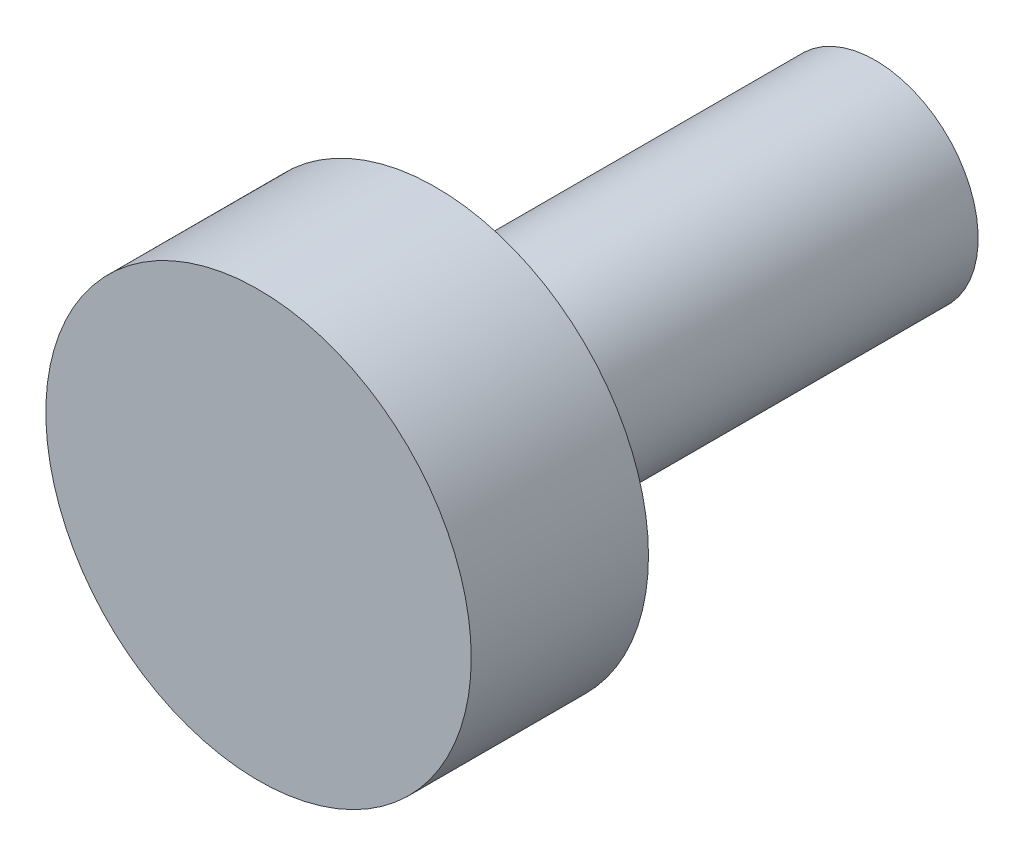
ISO-10303-21;
HEADER;
FILE_DESCRIPTION(('STEP AP214'),'2;1');
FILE_NAME('part.step','',(''),(''),'','','');
FILE_SCHEMA(('AUTOMOTIVE_DESIGN { 1 0 10303 214 1 1 1 1 }'));
ENDSEC;
DATA;
#1=APPLICATION_CONTEXT('core data for automotive mechanical design processes');
#2=APPLICATION_PROTOCOL_DEFINITION('international standard','automotive_design',2000,#1);
#3=PRODUCT_CONTEXT('',#1,'mechanical');
#4=PRODUCT('Part','Part','',(#3));
#5=PRODUCT_RELATED_PRODUCT_CATEGORY('part','',(#4));
#6=PRODUCT_DEFINITION_FORMATION('','',#4);
#7=PRODUCT_DEFINITION_CONTEXT('part definition',#1,'design');
#8=PRODUCT_DEFINITION('design','',#6,#7);
#9=PRODUCT_DEFINITION_SHAPE('','',#8);
#10=(LENGTH_UNIT() NAMED_UNIT(*) SI_UNIT(.MILLI.,.METRE.));
#11=(NAMED_UNIT(*) PLANE_ANGLE_UNIT() SI_UNIT($,.RADIAN.));
#12=(NAMED_UNIT(*) SI_UNIT($,.STERADIAN.) SOLID_ANGLE_UNIT());
#13=UNCERTAINTY_MEASURE_WITH_UNIT(LENGTH_MEASURE(1.E-05),#10,'distance_accuracy_value','');
#14=(GEOMETRIC_REPRESENTATION_CONTEXT(3) GLOBAL_UNCERTAINTY_ASSIGNED_CONTEXT((#13)) GLOBAL_UNIT_ASSIGNED_CONTEXT((#10,
#11,#12)) REPRESENTATION_CONTEXT('',''));
#15=CARTESIAN_POINT('',(0.,0.,0.));
#16=DIRECTION('',(0.,0.,1.));
#17=DIRECTION('',(1.,0.,0.));
#18=AXIS2_PLACEMENT_3D('',#15,#16,#17);
#19=CARTESIAN_POINT('',(0.,0.,2.5));
#20=DIRECTION('',(0.,0.,-1.));
#21=DIRECTION('',(-1.,0.,0.));
#22=AXIS2_PLACEMENT_3D('',#19,#20,#21);
#23=CYLINDRICAL_SURFACE('',#22,3.);
#24=CARTESIAN_POINT('',(0.,0.,2.5));
#25=DIRECTION('',(0.,0.,1.));
#26=DIRECTION('',(1.,0.,0.));
#27=AXIS2_PLACEMENT_3D('',#24,#25,#26);
#28=CIRCLE('',#27,3.);
#29=CARTESIAN_POINT('',(3.,0.,2.5));
#30=VERTEX_POINT('',#29);
#31=EDGE_CURVE('E10',#30,#30,#28,.T.);
#32=ORIENTED_EDGE('',*,*,#31,.F.);
#33=EDGE_LOOP('',(#32));
#34=FACE_BOUND('',#33,.T.);
#35=CARTESIAN_POINT('',(0.,0.,0.));
#36=DIRECTION('',(0.,0.,1.));
#37=DIRECTION('',(1.,0.,0.));
#38=AXIS2_PLACEMENT_3D('',#35,#36,#37);
#39=CIRCLE('',#38,3.);
#40=CARTESIAN_POINT('',(3.,0.,0.));
#41=VERTEX_POINT('',#40);
#42=EDGE_CURVE('E37',#41,#41,#39,.T.);
#43=ORIENTED_EDGE('',*,*,#42,.T.);
#44=EDGE_LOOP('',(#43));
#45=FACE_BOUND('',#44,.T.);
#46=ADVANCED_FACE('F40',(#34,#45),#23,.T.);
#47=CARTESIAN_POINT('',(0.,0.,2.5));
#48=DIRECTION('',(0.,0.,1.));
#49=DIRECTION('',(1.,0.,0.));
#50=AXIS2_PLACEMENT_3D('',#47,#48,#49);
#51=PLANE('',#50);
#52=ORIENTED_EDGE('',*,*,#31,.T.);
#53=EDGE_LOOP('',(#52));
#54=FACE_BOUND('',#53,.T.);
#55=ADVANCED_FACE('F69',(#54),#51,.T.);
#56=CARTESIAN_POINT('',(0.,0.,0.));
#57=DIRECTION('',(0.,0.,1.));
#58=DIRECTION('',(1.,0.,0.));
#59=AXIS2_PLACEMENT_3D('',#56,#57,#58);
#60=PLANE('',#59);
#61=CARTESIAN_POINT('',(0.,0.,0.));
#62=DIRECTION('',(0.,0.,1.));
#63=DIRECTION('',(1.,0.,0.));
#64=AXIS2_PLACEMENT_3D('',#61,#62,#63);
#65=CIRCLE('',#64,1.45);
#66=CARTESIAN_POINT('',(-1.45,0.,0.));
#67=VERTEX_POINT('',#66);
#68=EDGE_CURVE('E50',#67,#67,#65,.T.);
#69=ORIENTED_EDGE('',*,*,#68,.T.);
#70=EDGE_LOOP('',(#69));
#71=FACE_BOUND('',#70,.T.);
#72=ORIENTED_EDGE('',*,*,#42,.F.);
#73=EDGE_LOOP('',(#72));
#74=FACE_BOUND('',#73,.T.);
#75=ADVANCED_FACE('F54',(#71,#74),#60,.F.);
#76=CARTESIAN_POINT('',(0.,0.,0.));
#77=DIRECTION('',(0.,0.,-1.));
#78=DIRECTION('',(-1.,0.,0.));
#79=AXIS2_PLACEMENT_3D('',#76,#77,#78);
#80=CYLINDRICAL_SURFACE('',#79,1.45);
#81=CARTESIAN_POINT('',(0.,0.,-6.2));
#82=DIRECTION('',(0.,0.,1.));
#83=DIRECTION('',(1.,0.,0.));
#84=AXIS2_PLACEMENT_3D('',#81,#82,#83);
#85=CIRCLE('',#84,1.45);
#86=CARTESIAN_POINT('',(-1.45,0.,-6.2));
#87=VERTEX_POINT('',#86);
#88=EDGE_CURVE('E47',#87,#87,#85,.T.);
#89=CARTESIAN_POINT('',(-1.45,0.,0.));
#90=CARTESIAN_POINT('',(-1.45,0.,-0.0645833333333333));
#91=CARTESIAN_POINT('',(-1.45,0.,-0.129166666666667));
#92=CARTESIAN_POINT('',(-1.45,0.,-0.258333333333333));
#93=CARTESIAN_POINT('',(-1.45,0.,-0.322916666666667));
#94=CARTESIAN_POINT('',(-1.45,0.,-0.452083333333333));
#95=CARTESIAN_POINT('',(-1.45,0.,-0.516666666666667));
#96=CARTESIAN_POINT('',(-1.45,0.,-0.645833333333333));
#97=CARTESIAN_POINT('',(-1.45,0.,-0.710416666666667));
#98=CARTESIAN_POINT('',(-1.45,0.,-0.839583333333333));
#99=CARTESIAN_POINT('',(-1.45,0.,-0.904166666666667));
#100=CARTESIAN_POINT('',(-1.45,0.,-1.03333333333333));
#101=CARTESIAN_POINT('',(-1.45,0.,-1.09791666666667));
#102=CARTESIAN_POINT('',(-1.45,0.,-1.22708333333333));
#103=CARTESIAN_POINT('',(-1.45,0.,-1.29166666666667));
#104=CARTESIAN_POINT('',(-1.45,0.,-1.42083333333333));
#105=CARTESIAN_POINT('',(-1.45,0.,-1.48541666666667));
#106=CARTESIAN_POINT('',(-1.45,0.,-1.61458333333333));
#107=CARTESIAN_POINT('',(-1.45,0.,-1.67916666666667));
#108=CARTESIAN_POINT('',(-1.45,0.,-1.80833333333333));
#109=CARTESIAN_POINT('',(-1.45,0.,-1.87291666666667));
#110=CARTESIAN_POINT('',(-1.45,0.,-2.00208333333333));
#111=CARTESIAN_POINT('',(-1.45,0.,-2.06666666666667));
#112=CARTESIAN_POINT('',(-1.45,0.,-2.19583333333333));
#113=CARTESIAN_POINT('',(-1.45,0.,-2.26041666666667));
#114=CARTESIAN_POINT('',(-1.45,0.,-2.38958333333333));
#115=CARTESIAN_POINT('',(-1.45,0.,-2.45416666666667));
#116=CARTESIAN_POINT('',(-1.45,0.,-2.58333333333333));
#117=CARTESIAN_POINT('',(-1.45,0.,-2.64791666666667));
#118=CARTESIAN_POINT('',(-1.45,0.,-2.77708333333333));
#119=CARTESIAN_POINT('',(-1.45,0.,-2.84166666666667));
#120=CARTESIAN_POINT('',(-1.45,0.,-2.97083333333333));
#121=CARTESIAN_POINT('',(-1.45,0.,-3.03541666666667));
#122=CARTESIAN_POINT('',(-1.45,0.,-3.16458333333333));
#123=CARTESIAN_POINT('',(-1.45,0.,-3.22916666666667));
#124=CARTESIAN_POINT('',(-1.45,0.,-3.35833333333333));
#125=CARTESIAN_POINT('',(-1.45,0.,-3.42291666666667));
#126=CARTESIAN_POINT('',(-1.45,0.,-3.55208333333333));
#127=CARTESIAN_POINT('',(-1.45,0.,-3.61666666666667));
#128=CARTESIAN_POINT('',(-1.45,0.,-3.74583333333333));
#129=CARTESIAN_POINT('',(-1.45,0.,-3.81041666666667));
#130=CARTESIAN_POINT('',(-1.45,0.,-3.93958333333333));
#131=CARTESIAN_POINT('',(-1.45,0.,-4.00416666666667));
#132=CARTESIAN_POINT('',(-1.45,0.,-4.13333333333333));
#133=CARTESIAN_POINT('',(-1.45,0.,-4.19791666666667));
#134=CARTESIAN_POINT('',(-1.45,0.,-4.32708333333333));
#135=CARTESIAN_POINT('',(-1.45,0.,-4.39166666666667));
#136=CARTESIAN_POINT('',(-1.45,0.,-4.52083333333333));
#137=CARTESIAN_POINT('',(-1.45,0.,-4.58541666666667));
#138=CARTESIAN_POINT('',(-1.45,0.,-4.71458333333333));
#139=CARTESIAN_POINT('',(-1.45,0.,-4.77916666666667));
#140=CARTESIAN_POINT('',(-1.45,0.,-4.90833333333333));
#141=CARTESIAN_POINT('',(-1.45,0.,-4.97291666666667));
#142=CARTESIAN_POINT('',(-1.45,0.,-5.10208333333333));
#143=CARTESIAN_POINT('',(-1.45,0.,-5.16666666666667));
#144=CARTESIAN_POINT('',(-1.45,0.,-5.29583333333333));
#145=CARTESIAN_POINT('',(-1.45,0.,-5.36041666666667));
#146=CARTESIAN_POINT('',(-1.45,0.,-5.48958333333333));
#147=CARTESIAN_POINT('',(-1.45,0.,-5.55416666666667));
#148=CARTESIAN_POINT('',(-1.45,0.,-5.68333333333333));
#149=CARTESIAN_POINT('',(-1.45,0.,-5.74791666666667));
#150=CARTESIAN_POINT('',(-1.45,0.,-5.87708333333333));
#151=CARTESIAN_POINT('',(-1.45,0.,-5.94166666666667));
#152=CARTESIAN_POINT('',(-1.45,0.,-6.07083333333333));
#153=CARTESIAN_POINT('',(-1.45,0.,-6.13541666666667));
#154=CARTESIAN_POINT('',(-1.45,0.,-6.2));
#155=B_SPLINE_CURVE_WITH_KNOTS('',3,(#89,#90,#91,#92,#93,#94,#95,#96,#97,#98,#99,#100,#101,#102,
#103,#104,#105,#106,#107,#108,#109,#110,#111,#112,#113,#114,#115,#116,#117,#118,#119,#120,#121,
#122,#123,#124,#125,#126,#127,#128,#129,#130,#131,#132,#133,#134,#135,#136,#137,#138,#139,#140,
#141,#142,#143,#144,#145,#146,#147,#148,#149,#150,#151,#152,#153,#154),.UNSPECIFIED.,.F.,.F.,(4,
2,2,2,2,2,2,2,2,2,2,2,2,2,2,2,2,2,2,2,2,2,2,2,2,2,2,2,2,2,2,2,4),(0.,0.19375,0.3875,0.58125,
0.775,0.96875,1.1625,1.35625,1.55,1.74375,1.9375,2.13125,2.325,2.51875,2.7125,2.90625,3.1,
3.29375,3.4875,3.68125,3.875,4.06875,4.2625,4.45625,4.65,4.84375,5.0375,5.23125,5.425,5.61875,
5.8125,6.00625,6.2),.UNSPECIFIED.);
#156=EDGE_CURVE('BSEAM59',#67,#87,#155,.T.);
#157=ORIENTED_EDGE('',*,*,#68,.F.);
#158=ORIENTED_EDGE('',*,*,#88,.T.);
#159=ORIENTED_EDGE('',*,*,#156,.T.);
#160=ORIENTED_EDGE('',*,*,#156,.F.);
#161=EDGE_LOOP('',(#157,#159,#158,#160));
#162=FACE_BOUND('',#161,.T.);
#163=ADVANCED_FACE('F59',(#162),#80,.T.);
#164=CARTESIAN_POINT('',(0.,0.,-6.2));
#165=DIRECTION('',(0.,0.,1.));
#166=DIRECTION('',(1.,0.,0.));
#167=AXIS2_PLACEMENT_3D('',#164,#165,#166);
#168=PLANE('',#167);
#169=ORIENTED_EDGE('',*,*,#88,.F.);
#170=EDGE_LOOP('',(#169));
#171=FACE_BOUND('',#170,.T.);
#172=ADVANCED_FACE('F61',(#171),#168,.F.);
#173=CLOSED_SHELL('',(#46,#55,#75,#163,#172));
#174=MANIFOLD_SOLID_BREP('B2',#173);
#175=ADVANCED_BREP_SHAPE_REPRESENTATION('',(#18,#174),#14);
#176=SHAPE_DEFINITION_REPRESENTATION(#9,#175);
ENDSEC;
END-ISO-10303-21;
